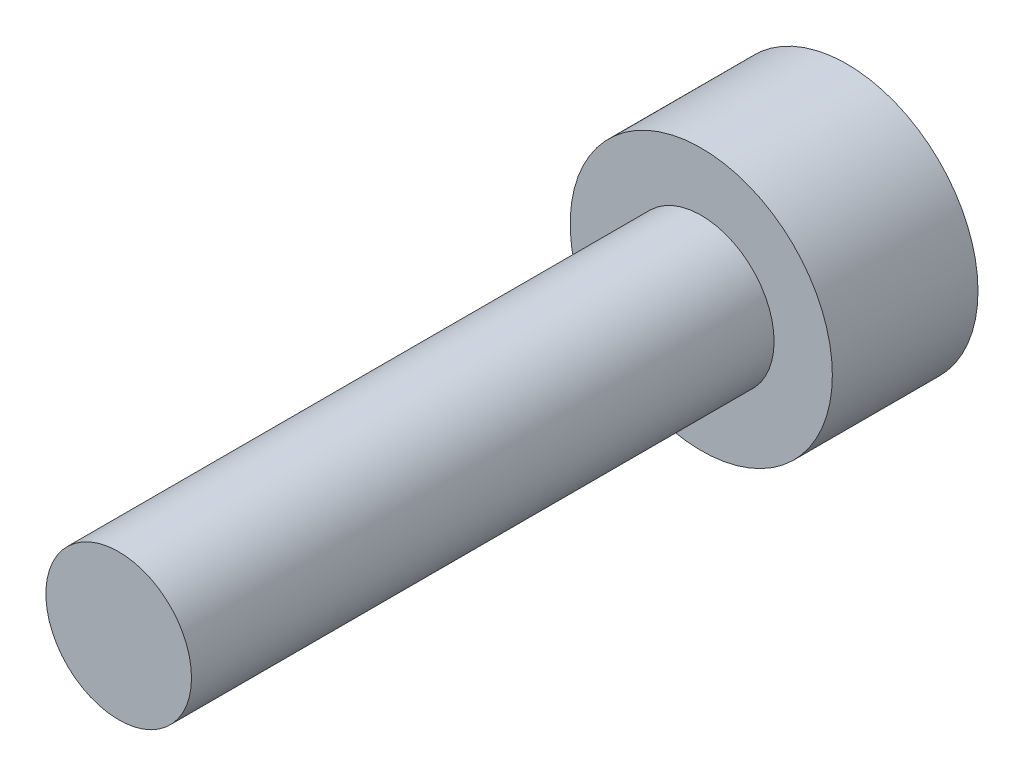
ISO-10303-21;
HEADER;
FILE_DESCRIPTION(('STEP AP214'),'2;1');
FILE_NAME('part.step','',(''),(''),'','','');
FILE_SCHEMA(('AUTOMOTIVE_DESIGN { 1 0 10303 214 1 1 1 1 }'));
ENDSEC;
DATA;
#1=APPLICATION_CONTEXT('core data for automotive mechanical design processes');
#2=APPLICATION_PROTOCOL_DEFINITION('international standard','automotive_design',2000,#1);
#3=PRODUCT_CONTEXT('',#1,'mechanical');
#4=PRODUCT('Part','Part','',(#3));
#5=PRODUCT_RELATED_PRODUCT_CATEGORY('part','',(#4));
#6=PRODUCT_DEFINITION_FORMATION('','',#4);
#7=PRODUCT_DEFINITION_CONTEXT('part definition',#1,'design');
#8=PRODUCT_DEFINITION('design','',#6,#7);
#9=PRODUCT_DEFINITION_SHAPE('','',#8);
#10=(LENGTH_UNIT() NAMED_UNIT(*) SI_UNIT(.MILLI.,.METRE.));
#11=(NAMED_UNIT(*) PLANE_ANGLE_UNIT() SI_UNIT($,.RADIAN.));
#12=(NAMED_UNIT(*) SI_UNIT($,.STERADIAN.) SOLID_ANGLE_UNIT());
#13=UNCERTAINTY_MEASURE_WITH_UNIT(LENGTH_MEASURE(1.E-05),#10,'distance_accuracy_value','');
#14=(GEOMETRIC_REPRESENTATION_CONTEXT(3) GLOBAL_UNCERTAINTY_ASSIGNED_CONTEXT((#13)) GLOBAL_UNIT_ASSIGNED_CONTEXT((#10,
#11,#12)) REPRESENTATION_CONTEXT('',''));
#15=CARTESIAN_POINT('',(0.,0.,0.));
#16=DIRECTION('',(0.,0.,1.));
#17=DIRECTION('',(1.,0.,0.));
#18=AXIS2_PLACEMENT_3D('',#15,#16,#17);
#19=CARTESIAN_POINT('',(0.,0.,-2.5));
#20=DIRECTION('',(0.,0.,1.));
#21=DIRECTION('',(1.,0.,0.));
#22=AXIS2_PLACEMENT_3D('',#19,#20,#21);
#23=PLANE('',#22);
#24=CARTESIAN_POINT('',(0.,0.,-2.5));
#25=DIRECTION('',(0.,0.,1.));
#26=DIRECTION('',(1.,0.,0.));
#27=AXIS2_PLACEMENT_3D('',#24,#25,#26);
#28=CIRCLE('',#27,2.25);
#29=CARTESIAN_POINT('',(2.25,0.,-2.5));
#30=VERTEX_POINT('',#29);
#31=EDGE_CURVE('E50',#30,#30,#28,.T.);
#32=ORIENTED_EDGE('',*,*,#31,.F.);
#33=EDGE_LOOP('',(#32));
#34=FACE_BOUND('',#33,.T.);
#35=DIRECTION('',(0.866025403784441,-0.499999999999995,0.));
#36=VECTOR('',#35,1.);
#37=CARTESIAN_POINT('',(-0.999999999999993,-0.577350269189637,-2.5));
#38=LINE('',#37,#36);
#39=CARTESIAN_POINT('',(-0.999999999999993,-0.577350269189637,-2.5));
#40=VERTEX_POINT('',#39);
#41=CARTESIAN_POINT('',(0.,-1.15470053837925,-2.5));
#42=VERTEX_POINT('',#41);
#43=EDGE_CURVE('E61',#40,#42,#38,.T.);
#44=ORIENTED_EDGE('',*,*,#43,.T.);
#45=DIRECTION('',(0.866025403784438,0.500000000000001,0.));
#46=VECTOR('',#45,1.);
#47=CARTESIAN_POINT('',(0.,-1.15470053837925,-2.5));
#48=LINE('',#47,#46);
#49=CARTESIAN_POINT('',(1.,-0.577350269189624,-2.5));
#50=VERTEX_POINT('',#49);
#51=EDGE_CURVE('E139',#42,#50,#48,.T.);
#52=ORIENTED_EDGE('',*,*,#51,.T.);
#53=DIRECTION('',(0.,1.,0.));
#54=VECTOR('',#53,1.);
#55=CARTESIAN_POINT('',(1.,-0.577350269189624,-2.5));
#56=LINE('',#55,#54);
#57=CARTESIAN_POINT('',(0.999999999999998,0.57735026918963,-2.5));
#58=VERTEX_POINT('',#57);
#59=EDGE_CURVE('E142',#50,#58,#56,.T.);
#60=ORIENTED_EDGE('',*,*,#59,.T.);
#61=DIRECTION('',(-0.866025403784442,0.499999999999995,0.));
#62=VECTOR('',#61,1.);
#63=CARTESIAN_POINT('',(0.999999999999998,0.57735026918963,-2.5));
#64=LINE('',#63,#62);
#65=CARTESIAN_POINT('',(0.,1.15470053837925,-2.5));
#66=VERTEX_POINT('',#65);
#67=EDGE_CURVE('E148',#58,#66,#64,.T.);
#68=ORIENTED_EDGE('',*,*,#67,.T.);
#69=DIRECTION('',(-0.866025403784434,-0.500000000000007,0.));
#70=VECTOR('',#69,1.);
#71=CARTESIAN_POINT('',(0.,1.15470053837925,-2.5));
#72=LINE('',#71,#70);
#73=CARTESIAN_POINT('',(-1.00000000000001,0.577350269189617,-2.5));
#74=VERTEX_POINT('',#73);
#75=EDGE_CURVE('E124',#66,#74,#72,.T.);
#76=ORIENTED_EDGE('',*,*,#75,.T.);
#77=DIRECTION('',(0.,-1.,0.));
#78=VECTOR('',#77,1.);
#79=CARTESIAN_POINT('',(-1.00000000000001,0.577350269189617,-2.5));
#80=LINE('',#79,#78);
#81=EDGE_CURVE('E147',#74,#40,#80,.T.);
#82=ORIENTED_EDGE('',*,*,#81,.T.);
#83=EDGE_LOOP('',(#44,#52,#60,#68,#76,#82));
#84=FACE_BOUND('',#83,.T.);
#85=ADVANCED_FACE('F43',(#34,#84),#23,.F.);
#86=CARTESIAN_POINT('',(0.,0.,0.));
#87=DIRECTION('',(0.,0.,-1.));
#88=DIRECTION('',(-1.,0.,0.));
#89=AXIS2_PLACEMENT_3D('',#86,#87,#88);
#90=CYLINDRICAL_SURFACE('',#89,2.25);
#91=CARTESIAN_POINT('',(0.,0.,0.));
#92=DIRECTION('',(0.,0.,1.));
#93=DIRECTION('',(1.,0.,0.));
#94=AXIS2_PLACEMENT_3D('',#91,#92,#93);
#95=CIRCLE('',#94,2.25);
#96=CARTESIAN_POINT('',(2.25,0.,0.));
#97=VERTEX_POINT('',#96);
#98=EDGE_CURVE('E52',#97,#97,#95,.T.);
#99=ORIENTED_EDGE('',*,*,#98,.F.);
#100=EDGE_LOOP('',(#99));
#101=FACE_BOUND('',#100,.T.);
#102=ORIENTED_EDGE('',*,*,#31,.T.);
#103=EDGE_LOOP('',(#102));
#104=FACE_BOUND('',#103,.T.);
#105=ADVANCED_FACE('F44',(#101,#104),#90,.T.);
#106=CARTESIAN_POINT('',(0.,0.,0.));
#107=DIRECTION('',(0.,0.,1.));
#108=DIRECTION('',(1.,0.,0.));
#109=AXIS2_PLACEMENT_3D('',#106,#107,#108);
#110=PLANE('',#109);
#111=CARTESIAN_POINT('',(0.,0.,0.));
#112=DIRECTION('',(0.,0.,1.));
#113=DIRECTION('',(1.,0.,0.));
#114=AXIS2_PLACEMENT_3D('',#111,#112,#113);
#115=CIRCLE('',#114,1.25);
#116=CARTESIAN_POINT('',(1.25,0.,0.));
#117=VERTEX_POINT('',#116);
#118=EDGE_CURVE('E11',#117,#117,#115,.T.);
#119=ORIENTED_EDGE('',*,*,#118,.F.);
#120=EDGE_LOOP('',(#119));
#121=FACE_BOUND('',#120,.T.);
#122=ORIENTED_EDGE('',*,*,#98,.T.);
#123=EDGE_LOOP('',(#122));
#124=FACE_BOUND('',#123,.T.);
#125=ADVANCED_FACE('F211',(#121,#124),#110,.T.);
#126=CARTESIAN_POINT('',(0.,0.,10.));
#127=DIRECTION('',(0.,0.,-1.));
#128=DIRECTION('',(-1.,0.,0.));
#129=AXIS2_PLACEMENT_3D('',#126,#127,#128);
#130=CYLINDRICAL_SURFACE('',#129,1.25);
#131=CARTESIAN_POINT('',(0.,0.,10.));
#132=DIRECTION('',(0.,0.,1.));
#133=DIRECTION('',(1.,0.,0.));
#134=AXIS2_PLACEMENT_3D('',#131,#132,#133);
#135=CIRCLE('',#134,1.25);
#136=CARTESIAN_POINT('',(1.25,0.,10.));
#137=VERTEX_POINT('',#136);
#138=EDGE_CURVE('E170',#137,#137,#135,.T.);
#139=ORIENTED_EDGE('',*,*,#138,.F.);
#140=EDGE_LOOP('',(#139));
#141=FACE_BOUND('',#140,.T.);
#142=ORIENTED_EDGE('',*,*,#118,.T.);
#143=EDGE_LOOP('',(#142));
#144=FACE_BOUND('',#143,.T.);
#145=ADVANCED_FACE('F210',(#141,#144),#130,.T.);
#146=CARTESIAN_POINT('',(0.,0.,10.));
#147=DIRECTION('',(0.,0.,1.));
#148=DIRECTION('',(1.,0.,0.));
#149=AXIS2_PLACEMENT_3D('',#146,#147,#148);
#150=PLANE('',#149);
#151=ORIENTED_EDGE('',*,*,#138,.T.);
#152=EDGE_LOOP('',(#151));
#153=FACE_BOUND('',#152,.T.);
#154=ADVANCED_FACE('F203',(#153),#150,.T.);
#155=CARTESIAN_POINT('',(-0.999999999999993,-0.577350269189637,-1.25));
#156=DIRECTION('',(0.499999999999995,0.866025403784441,0.));
#157=DIRECTION('',(-0.866025403784441,0.499999999999995,0.));
#158=AXIS2_PLACEMENT_3D('',#155,#156,#157);
#159=PLANE('',#158);
#160=ORIENTED_EDGE('',*,*,#43,.F.);
#161=DIRECTION('',(0.,0.,-1.));
#162=VECTOR('',#161,1.);
#163=CARTESIAN_POINT('',(-0.999999999999993,-0.577350269189637,-1.25));
#164=LINE('',#163,#162);
#165=CARTESIAN_POINT('',(-0.999999999999993,-0.577350269189637,-1.25));
#166=VERTEX_POINT('',#165);
#167=EDGE_CURVE('E135',#166,#40,#164,.T.);
#168=ORIENTED_EDGE('',*,*,#167,.F.);
#169=DIRECTION('',(0.866025403784441,-0.499999999999995,0.));
#170=VECTOR('',#169,1.);
#171=CARTESIAN_POINT('',(-0.999999999999993,-0.577350269189637,-1.25));
#172=LINE('',#171,#170);
#173=CARTESIAN_POINT('',(0.,-1.15470053837925,-1.25));
#174=VERTEX_POINT('',#173);
#175=EDGE_CURVE('E152',#166,#174,#172,.T.);
#176=ORIENTED_EDGE('',*,*,#175,.T.);
#177=DIRECTION('',(0.,0.,-1.));
#178=VECTOR('',#177,1.);
#179=CARTESIAN_POINT('',(0.,-1.15470053837925,-1.25));
#180=LINE('',#179,#178);
#181=EDGE_CURVE('E163',#174,#42,#180,.T.);
#182=ORIENTED_EDGE('',*,*,#181,.T.);
#183=EDGE_LOOP('',(#160,#168,#176,#182));
#184=FACE_BOUND('',#183,.T.);
#185=ADVANCED_FACE('F181',(#184),#159,.T.);
#186=CARTESIAN_POINT('',(0.,-1.15470053837925,-1.25));
#187=DIRECTION('',(-0.500000000000001,0.866025403784438,0.));
#188=DIRECTION('',(-0.866025403784438,-0.500000000000001,0.));
#189=AXIS2_PLACEMENT_3D('',#186,#187,#188);
#190=PLANE('',#189);
#191=ORIENTED_EDGE('',*,*,#51,.F.);
#192=ORIENTED_EDGE('',*,*,#181,.F.);
#193=DIRECTION('',(0.866025403784438,0.500000000000001,0.));
#194=VECTOR('',#193,1.);
#195=CARTESIAN_POINT('',(0.,-1.15470053837925,-1.25));
#196=LINE('',#195,#194);
#197=CARTESIAN_POINT('',(1.,-0.577350269189624,-1.25));
#198=VERTEX_POINT('',#197);
#199=EDGE_CURVE('E99',#174,#198,#196,.T.);
#200=ORIENTED_EDGE('',*,*,#199,.T.);
#201=DIRECTION('',(0.,0.,-1.));
#202=VECTOR('',#201,1.);
#203=CARTESIAN_POINT('',(1.,-0.577350269189624,-1.25));
#204=LINE('',#203,#202);
#205=EDGE_CURVE('E161',#198,#50,#204,.T.);
#206=ORIENTED_EDGE('',*,*,#205,.T.);
#207=EDGE_LOOP('',(#191,#192,#200,#206));
#208=FACE_BOUND('',#207,.T.);
#209=ADVANCED_FACE('F193',(#208),#190,.T.);
#210=CARTESIAN_POINT('',(1.,-0.577350269189624,-1.25));
#211=DIRECTION('',(-1.,0.,0.));
#212=DIRECTION('',(0.,-1.,0.));
#213=AXIS2_PLACEMENT_3D('',#210,#211,#212);
#214=PLANE('',#213);
#215=ORIENTED_EDGE('',*,*,#59,.F.);
#216=ORIENTED_EDGE('',*,*,#205,.F.);
#217=DIRECTION('',(0.,1.,0.));
#218=VECTOR('',#217,1.);
#219=CARTESIAN_POINT('',(1.,-0.577350269189624,-1.25));
#220=LINE('',#219,#218);
#221=CARTESIAN_POINT('',(0.999999999999998,0.57735026918963,-1.25));
#222=VERTEX_POINT('',#221);
#223=EDGE_CURVE('E118',#198,#222,#220,.T.);
#224=ORIENTED_EDGE('',*,*,#223,.T.);
#225=DIRECTION('',(0.,0.,-1.));
#226=VECTOR('',#225,1.);
#227=CARTESIAN_POINT('',(0.999999999999998,0.57735026918963,-1.25));
#228=LINE('',#227,#226);
#229=EDGE_CURVE('E113',#222,#58,#228,.T.);
#230=ORIENTED_EDGE('',*,*,#229,.T.);
#231=EDGE_LOOP('',(#215,#216,#224,#230));
#232=FACE_BOUND('',#231,.T.);
#233=ADVANCED_FACE('F192',(#232),#214,.T.);
#234=CARTESIAN_POINT('',(0.999999999999998,0.57735026918963,-1.25));
#235=DIRECTION('',(-0.499999999999995,-0.866025403784442,0.));
#236=DIRECTION('',(0.866025403784442,-0.499999999999995,0.));
#237=AXIS2_PLACEMENT_3D('',#234,#235,#236);
#238=PLANE('',#237);
#239=ORIENTED_EDGE('',*,*,#67,.F.);
#240=ORIENTED_EDGE('',*,*,#229,.F.);
#241=DIRECTION('',(-0.866025403784442,0.499999999999995,0.));
#242=VECTOR('',#241,1.);
#243=CARTESIAN_POINT('',(0.999999999999998,0.57735026918963,-1.25));
#244=LINE('',#243,#242);
#245=CARTESIAN_POINT('',(0.,1.15470053837925,-1.25));
#246=VERTEX_POINT('',#245);
#247=EDGE_CURVE('E109',#222,#246,#244,.T.);
#248=ORIENTED_EDGE('',*,*,#247,.T.);
#249=DIRECTION('',(0.,0.,-1.));
#250=VECTOR('',#249,1.);
#251=CARTESIAN_POINT('',(0.,1.15470053837925,-1.25));
#252=LINE('',#251,#250);
#253=EDGE_CURVE('E111',#246,#66,#252,.T.);
#254=ORIENTED_EDGE('',*,*,#253,.T.);
#255=EDGE_LOOP('',(#239,#240,#248,#254));
#256=FACE_BOUND('',#255,.T.);
#257=ADVANCED_FACE('F114',(#256),#238,.T.);
#258=CARTESIAN_POINT('',(0.,1.15470053837925,-1.25));
#259=DIRECTION('',(0.500000000000007,-0.866025403784435,0.));
#260=DIRECTION('',(0.866025403784435,0.500000000000007,0.));
#261=AXIS2_PLACEMENT_3D('',#258,#259,#260);
#262=PLANE('',#261);
#263=ORIENTED_EDGE('',*,*,#75,.F.);
#264=ORIENTED_EDGE('',*,*,#253,.F.);
#265=DIRECTION('',(-0.866025403784434,-0.500000000000007,0.));
#266=VECTOR('',#265,1.);
#267=CARTESIAN_POINT('',(0.,1.15470053837925,-1.25));
#268=LINE('',#267,#266);
#269=CARTESIAN_POINT('',(-1.00000000000001,0.577350269189617,-1.25));
#270=VERTEX_POINT('',#269);
#271=EDGE_CURVE('E117',#246,#270,#268,.T.);
#272=ORIENTED_EDGE('',*,*,#271,.T.);
#273=DIRECTION('',(0.,0.,-1.));
#274=VECTOR('',#273,1.);
#275=CARTESIAN_POINT('',(-1.00000000000001,0.577350269189617,-1.25));
#276=LINE('',#275,#274);
#277=EDGE_CURVE('E93',#270,#74,#276,.T.);
#278=ORIENTED_EDGE('',*,*,#277,.T.);
#279=EDGE_LOOP('',(#263,#264,#272,#278));
#280=FACE_BOUND('',#279,.T.);
#281=ADVANCED_FACE('F121',(#280),#262,.T.);
#282=CARTESIAN_POINT('',(-1.00000000000001,0.577350269189617,-1.25));
#283=DIRECTION('',(1.,0.,0.));
#284=DIRECTION('',(0.,1.,0.));
#285=AXIS2_PLACEMENT_3D('',#282,#283,#284);
#286=PLANE('',#285);
#287=ORIENTED_EDGE('',*,*,#81,.F.);
#288=ORIENTED_EDGE('',*,*,#277,.F.);
#289=DIRECTION('',(0.,-1.,0.));
#290=VECTOR('',#289,1.);
#291=CARTESIAN_POINT('',(-1.00000000000001,0.577350269189617,-1.25));
#292=LINE('',#291,#290);
#293=EDGE_CURVE('E68',#270,#166,#292,.T.);
#294=ORIENTED_EDGE('',*,*,#293,.T.);
#295=ORIENTED_EDGE('',*,*,#167,.T.);
#296=EDGE_LOOP('',(#287,#288,#294,#295));
#297=FACE_BOUND('',#296,.T.);
#298=ADVANCED_FACE('F185',(#297),#286,.T.);
#299=CARTESIAN_POINT('',(0.,0.,-1.25));
#300=DIRECTION('',(0.,0.,1.));
#301=DIRECTION('',(1.,0.,0.));
#302=AXIS2_PLACEMENT_3D('',#299,#300,#301);
#303=PLANE('',#302);
#304=ORIENTED_EDGE('',*,*,#175,.F.);
#305=ORIENTED_EDGE('',*,*,#293,.F.);
#306=ORIENTED_EDGE('',*,*,#271,.F.);
#307=ORIENTED_EDGE('',*,*,#247,.F.);
#308=ORIENTED_EDGE('',*,*,#223,.F.);
#309=ORIENTED_EDGE('',*,*,#199,.F.);
#310=EDGE_LOOP('',(#304,#305,#306,#307,#308,#309));
#311=FACE_BOUND('',#310,.T.);
#312=ADVANCED_FACE('F130',(#311),#303,.F.);
#313=CLOSED_SHELL('',(#85,#105,#125,#145,#154,#185,#209,#233,#257,#281,#298,#312));
#314=MANIFOLD_SOLID_BREP('B2',#313);
#315=ADVANCED_BREP_SHAPE_REPRESENTATION('',(#18,#314),#14);
#316=SHAPE_DEFINITION_REPRESENTATION(#9,#315);
ENDSEC;
END-ISO-10303-21;
